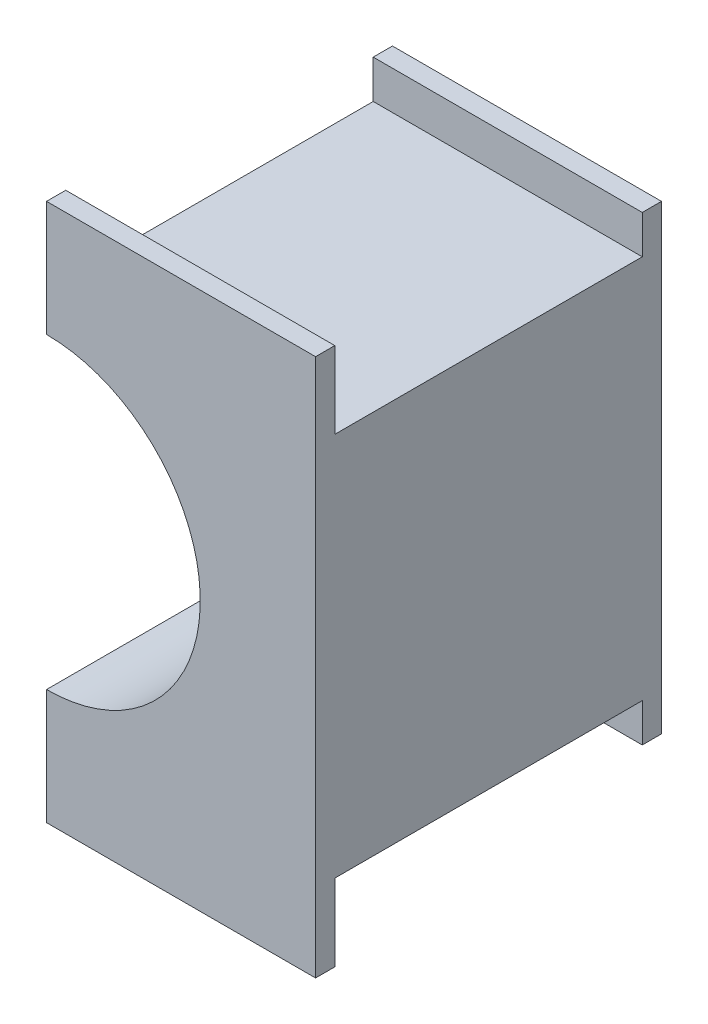
ISO-10303-21;
HEADER;
FILE_DESCRIPTION(('STEP AP214'),'2;1');
FILE_NAME('part.step','',(''),(''),'','','');
FILE_SCHEMA(('AUTOMOTIVE_DESIGN { 1 0 10303 214 1 1 1 1 }'));
ENDSEC;
DATA;
#1=APPLICATION_CONTEXT('core data for automotive mechanical design processes');
#2=APPLICATION_PROTOCOL_DEFINITION('international standard','automotive_design',2000,#1);
#3=PRODUCT_CONTEXT('',#1,'mechanical');
#4=PRODUCT('Part','Part','',(#3));
#5=PRODUCT_RELATED_PRODUCT_CATEGORY('part','',(#4));
#6=PRODUCT_DEFINITION_FORMATION('','',#4);
#7=PRODUCT_DEFINITION_CONTEXT('part definition',#1,'design');
#8=PRODUCT_DEFINITION('design','',#6,#7);
#9=PRODUCT_DEFINITION_SHAPE('','',#8);
#10=(LENGTH_UNIT() NAMED_UNIT(*) SI_UNIT(.MILLI.,.METRE.));
#11=(NAMED_UNIT(*) PLANE_ANGLE_UNIT() SI_UNIT($,.RADIAN.));
#12=(NAMED_UNIT(*) SI_UNIT($,.STERADIAN.) SOLID_ANGLE_UNIT());
#13=UNCERTAINTY_MEASURE_WITH_UNIT(LENGTH_MEASURE(1.E-05),#10,'distance_accuracy_value','');
#14=(GEOMETRIC_REPRESENTATION_CONTEXT(3) GLOBAL_UNCERTAINTY_ASSIGNED_CONTEXT((#13)) GLOBAL_UNIT_ASSIGNED_CONTEXT((#10,
#11,#12)) REPRESENTATION_CONTEXT('',''));
#15=CARTESIAN_POINT('',(0.,0.,0.));
#16=DIRECTION('',(0.,0.,1.));
#17=DIRECTION('',(1.,0.,0.));
#18=AXIS2_PLACEMENT_3D('',#15,#16,#17);
#19=CARTESIAN_POINT('',(1.,0.,4.5));
#20=DIRECTION('',(1.,0.,0.));
#21=DIRECTION('',(0.,1.,0.));
#22=AXIS2_PLACEMENT_3D('',#19,#20,#21);
#23=PLANE('',#22);
#24=DIRECTION('',(0.,0.,1.));
#25=VECTOR('',#24,1.);
#26=CARTESIAN_POINT('',(1.,2.5,0.));
#27=LINE('',#26,#25);
#28=CARTESIAN_POINT('',(1.,2.5,0.25));
#29=VERTEX_POINT('',#28);
#30=CARTESIAN_POINT('',(1.,2.5,4.25));
#31=VERTEX_POINT('',#30);
#32=EDGE_CURVE('E146',#29,#31,#27,.T.);
#33=ORIENTED_EDGE('',*,*,#32,.T.);
#34=DIRECTION('',(0.,-1.,0.));
#35=VECTOR('',#34,1.);
#36=CARTESIAN_POINT('',(1.,0.,4.25));
#37=LINE('',#36,#35);
#38=CARTESIAN_POINT('',(1.,3.5,4.25));
#39=VERTEX_POINT('',#38);
#40=EDGE_CURVE('E138',#39,#31,#37,.T.);
#41=ORIENTED_EDGE('',*,*,#40,.F.);
#42=DIRECTION('',(0.,0.,-1.));
#43=VECTOR('',#42,1.);
#44=CARTESIAN_POINT('',(1.,3.5,4.5));
#45=LINE('',#44,#43);
#46=CARTESIAN_POINT('',(1.,3.5,4.5));
#47=VERTEX_POINT('',#46);
#48=EDGE_CURVE('E151',#47,#39,#45,.T.);
#49=ORIENTED_EDGE('',*,*,#48,.F.);
#50=DIRECTION('',(0.,-1.,0.));
#51=VECTOR('',#50,1.);
#52=CARTESIAN_POINT('',(1.,0.,4.5));
#53=LINE('',#52,#51);
#54=CARTESIAN_POINT('',(1.,-3.5,4.5));
#55=VERTEX_POINT('',#54);
#56=EDGE_CURVE('E216',#47,#55,#53,.T.);
#57=ORIENTED_EDGE('',*,*,#56,.T.);
#58=DIRECTION('',(0.,0.,-1.));
#59=VECTOR('',#58,1.);
#60=CARTESIAN_POINT('',(1.,-3.5,4.5));
#61=LINE('',#60,#59);
#62=CARTESIAN_POINT('',(1.,-3.5,4.25));
#63=VERTEX_POINT('',#62);
#64=EDGE_CURVE('E161',#55,#63,#61,.T.);
#65=ORIENTED_EDGE('',*,*,#64,.T.);
#66=DIRECTION('',(0.,1.,0.));
#67=VECTOR('',#66,1.);
#68=CARTESIAN_POINT('',(1.,0.,4.25));
#69=LINE('',#68,#67);
#70=CARTESIAN_POINT('',(1.,-2.5,4.25));
#71=VERTEX_POINT('',#70);
#72=EDGE_CURVE('E249',#63,#71,#69,.T.);
#73=ORIENTED_EDGE('',*,*,#72,.T.);
#74=DIRECTION('',(0.,0.,1.));
#75=VECTOR('',#74,1.);
#76=CARTESIAN_POINT('',(1.,-2.5,0.));
#77=LINE('',#76,#75);
#78=CARTESIAN_POINT('',(1.,-2.5,0.25));
#79=VERTEX_POINT('',#78);
#80=EDGE_CURVE('E208',#79,#71,#77,.T.);
#81=ORIENTED_EDGE('',*,*,#80,.F.);
#82=DIRECTION('',(0.,1.,0.));
#83=VECTOR('',#82,1.);
#84=CARTESIAN_POINT('',(1.,0.,0.25));
#85=LINE('',#84,#83);
#86=CARTESIAN_POINT('',(1.,-3.,0.25));
#87=VERTEX_POINT('',#86);
#88=EDGE_CURVE('E192',#87,#79,#85,.T.);
#89=ORIENTED_EDGE('',*,*,#88,.F.);
#90=DIRECTION('',(0.,0.,1.));
#91=VECTOR('',#90,1.);
#92=CARTESIAN_POINT('',(1.,-3.,0.));
#93=LINE('',#92,#91);
#94=CARTESIAN_POINT('',(1.,-3.,0.));
#95=VERTEX_POINT('',#94);
#96=EDGE_CURVE('E245',#95,#87,#93,.T.);
#97=ORIENTED_EDGE('',*,*,#96,.F.);
#98=DIRECTION('',(0.,-1.,0.));
#99=VECTOR('',#98,1.);
#100=CARTESIAN_POINT('',(1.,0.,0.));
#101=LINE('',#100,#99);
#102=CARTESIAN_POINT('',(1.,3.,0.));
#103=VERTEX_POINT('',#102);
#104=EDGE_CURVE('E226',#103,#95,#101,.T.);
#105=ORIENTED_EDGE('',*,*,#104,.F.);
#106=DIRECTION('',(0.,0.,1.));
#107=VECTOR('',#106,1.);
#108=CARTESIAN_POINT('',(1.,3.,0.));
#109=LINE('',#108,#107);
#110=CARTESIAN_POINT('',(1.,3.,0.25));
#111=VERTEX_POINT('',#110);
#112=EDGE_CURVE('E59',#103,#111,#109,.T.);
#113=ORIENTED_EDGE('',*,*,#112,.T.);
#114=DIRECTION('',(0.,-1.,0.));
#115=VECTOR('',#114,1.);
#116=CARTESIAN_POINT('',(1.,0.,0.25));
#117=LINE('',#116,#115);
#118=EDGE_CURVE('E378',#111,#29,#117,.T.);
#119=ORIENTED_EDGE('',*,*,#118,.T.);
#120=EDGE_LOOP('',(#33,#41,#49,#57,#65,#73,#81,#89,#97,#105,#113,#119));
#121=FACE_BOUND('',#120,.T.);
#122=ADVANCED_FACE('F36',(#121),#23,.T.);
#123=CARTESIAN_POINT('',(0.,3.5,4.5));
#124=DIRECTION('',(0.,1.,0.));
#125=DIRECTION('',(-1.,0.,0.));
#126=AXIS2_PLACEMENT_3D('',#123,#124,#125);
#127=PLANE('',#126);
#128=ORIENTED_EDGE('',*,*,#48,.T.);
#129=DIRECTION('',(-1.,0.,0.));
#130=VECTOR('',#129,1.);
#131=CARTESIAN_POINT('',(1.,3.5,4.25));
#132=LINE('',#131,#130);
#133=CARTESIAN_POINT('',(-2.5,3.5,4.25));
#134=VERTEX_POINT('',#133);
#135=EDGE_CURVE('E135',#39,#134,#132,.T.);
#136=ORIENTED_EDGE('',*,*,#135,.T.);
#137=DIRECTION('',(0.,0.,-1.));
#138=VECTOR('',#137,1.);
#139=CARTESIAN_POINT('',(-2.5,3.5,4.5));
#140=LINE('',#139,#138);
#141=CARTESIAN_POINT('',(-2.5,3.5,4.5));
#142=VERTEX_POINT('',#141);
#143=EDGE_CURVE('E162',#142,#134,#140,.T.);
#144=ORIENTED_EDGE('',*,*,#143,.F.);
#145=DIRECTION('',(1.,0.,0.));
#146=VECTOR('',#145,1.);
#147=CARTESIAN_POINT('',(0.,3.5,4.5));
#148=LINE('',#147,#146);
#149=EDGE_CURVE('E160',#142,#47,#148,.T.);
#150=ORIENTED_EDGE('',*,*,#149,.T.);
#151=EDGE_LOOP('',(#128,#136,#144,#150));
#152=FACE_BOUND('',#151,.T.);
#153=ADVANCED_FACE('F158',(#152),#127,.T.);
#154=CARTESIAN_POINT('',(-2.5,0.,4.5));
#155=DIRECTION('',(1.,0.,0.));
#156=DIRECTION('',(0.,1.,0.));
#157=AXIS2_PLACEMENT_3D('',#154,#155,#156);
#158=PLANE('',#157);
#159=DIRECTION('',(0.,-1.,0.));
#160=VECTOR('',#159,1.);
#161=CARTESIAN_POINT('',(-2.5,0.,4.25));
#162=LINE('',#161,#160);
#163=CARTESIAN_POINT('',(-2.5,2.5,4.25));
#164=VERTEX_POINT('',#163);
#165=EDGE_CURVE('E141',#134,#164,#162,.T.);
#166=ORIENTED_EDGE('',*,*,#165,.T.);
#167=DIRECTION('',(0.,0.,1.));
#168=VECTOR('',#167,1.);
#169=CARTESIAN_POINT('',(-2.5,2.5,0.));
#170=LINE('',#169,#168);
#171=CARTESIAN_POINT('',(-2.5,2.5,0.25));
#172=VERTEX_POINT('',#171);
#173=EDGE_CURVE('E155',#172,#164,#170,.T.);
#174=ORIENTED_EDGE('',*,*,#173,.F.);
#175=DIRECTION('',(0.,-1.,0.));
#176=VECTOR('',#175,1.);
#177=CARTESIAN_POINT('',(-2.5,0.,0.25));
#178=LINE('',#177,#176);
#179=CARTESIAN_POINT('',(-2.5,3.,0.25));
#180=VERTEX_POINT('',#179);
#181=EDGE_CURVE('E365',#180,#172,#178,.T.);
#182=ORIENTED_EDGE('',*,*,#181,.F.);
#183=DIRECTION('',(0.,0.,1.));
#184=VECTOR('',#183,1.);
#185=CARTESIAN_POINT('',(-2.5,3.,0.));
#186=LINE('',#185,#184);
#187=CARTESIAN_POINT('',(-2.5,3.,0.));
#188=VERTEX_POINT('',#187);
#189=EDGE_CURVE('E361',#188,#180,#186,.T.);
#190=ORIENTED_EDGE('',*,*,#189,.F.);
#191=DIRECTION('',(0.,-1.,0.));
#192=VECTOR('',#191,1.);
#193=CARTESIAN_POINT('',(-2.5,0.,0.));
#194=LINE('',#193,#192);
#195=CARTESIAN_POINT('',(-2.5,2.,0.));
#196=VERTEX_POINT('',#195);
#197=EDGE_CURVE('E212',#188,#196,#194,.T.);
#198=ORIENTED_EDGE('',*,*,#197,.T.);
#199=DIRECTION('',(0.,0.,-1.));
#200=VECTOR('',#199,1.);
#201=CARTESIAN_POINT('',(-2.5,2.,4.5));
#202=LINE('',#201,#200);
#203=CARTESIAN_POINT('',(-2.5,2.,4.5));
#204=VERTEX_POINT('',#203);
#205=EDGE_CURVE('E166',#204,#196,#202,.T.);
#206=ORIENTED_EDGE('',*,*,#205,.F.);
#207=DIRECTION('',(0.,-1.,0.));
#208=VECTOR('',#207,1.);
#209=CARTESIAN_POINT('',(-2.5,0.,4.5));
#210=LINE('',#209,#208);
#211=EDGE_CURVE('E214',#142,#204,#210,.T.);
#212=ORIENTED_EDGE('',*,*,#211,.F.);
#213=ORIENTED_EDGE('',*,*,#143,.T.);
#214=EDGE_LOOP('',(#166,#174,#182,#190,#198,#206,#212,#213));
#215=FACE_BOUND('',#214,.T.);
#216=ADVANCED_FACE('F236',(#215),#158,.F.);
#217=CARTESIAN_POINT('',(0.,0.,0.));
#218=DIRECTION('',(0.,0.,1.));
#219=DIRECTION('',(1.,0.,0.));
#220=AXIS2_PLACEMENT_3D('',#217,#218,#219);
#221=PLANE('',#220);
#222=ORIENTED_EDGE('',*,*,#197,.F.);
#223=DIRECTION('',(-1.,0.,0.));
#224=VECTOR('',#223,1.);
#225=CARTESIAN_POINT('',(1.,3.,0.));
#226=LINE('',#225,#224);
#227=EDGE_CURVE('E145',#103,#188,#226,.T.);
#228=ORIENTED_EDGE('',*,*,#227,.F.);
#229=ORIENTED_EDGE('',*,*,#104,.T.);
#230=DIRECTION('',(-1.,0.,0.));
#231=VECTOR('',#230,1.);
#232=CARTESIAN_POINT('',(1.,-3.,0.));
#233=LINE('',#232,#231);
#234=CARTESIAN_POINT('',(-2.5,-3.,0.));
#235=VERTEX_POINT('',#234);
#236=EDGE_CURVE('E204',#95,#235,#233,.T.);
#237=ORIENTED_EDGE('',*,*,#236,.T.);
#238=CARTESIAN_POINT('',(-2.5,-2.,0.));
#239=VERTEX_POINT('',#238);
#240=EDGE_CURVE('E222',#239,#235,#194,.T.);
#241=ORIENTED_EDGE('',*,*,#240,.F.);
#242=CARTESIAN_POINT('',(-2.5,0.,0.));
#243=DIRECTION('',(0.,0.,1.));
#244=DIRECTION('',(1.,0.,0.));
#245=AXIS2_PLACEMENT_3D('',#242,#243,#244);
#246=CIRCLE('',#245,2.);
#247=EDGE_CURVE('E219',#239,#196,#246,.T.);
#248=ORIENTED_EDGE('',*,*,#247,.T.);
#249=EDGE_LOOP('',(#222,#228,#229,#237,#241,#248));
#250=FACE_BOUND('',#249,.T.);
#251=ADVANCED_FACE('F241',(#250),#221,.F.);
#252=CARTESIAN_POINT('',(-2.5,0.,4.5));
#253=DIRECTION('',(0.,0.,-1.));
#254=DIRECTION('',(-1.,0.,0.));
#255=AXIS2_PLACEMENT_3D('',#252,#253,#254);
#256=CYLINDRICAL_SURFACE('',#255,2.);
#257=ORIENTED_EDGE('',*,*,#247,.F.);
#258=DIRECTION('',(0.,0.,-1.));
#259=VECTOR('',#258,1.);
#260=CARTESIAN_POINT('',(-2.5,-2.,4.5));
#261=LINE('',#260,#259);
#262=CARTESIAN_POINT('',(-2.5,-2.,4.5));
#263=VERTEX_POINT('',#262);
#264=EDGE_CURVE('E11',#263,#239,#261,.T.);
#265=ORIENTED_EDGE('',*,*,#264,.F.);
#266=CARTESIAN_POINT('',(-2.5,0.,4.5));
#267=DIRECTION('',(0.,0.,1.));
#268=DIRECTION('',(1.,0.,0.));
#269=AXIS2_PLACEMENT_3D('',#266,#267,#268);
#270=CIRCLE('',#269,2.);
#271=EDGE_CURVE('E209',#263,#204,#270,.T.);
#272=ORIENTED_EDGE('',*,*,#271,.T.);
#273=ORIENTED_EDGE('',*,*,#205,.T.);
#274=EDGE_LOOP('',(#257,#265,#272,#273));
#275=FACE_BOUND('',#274,.T.);
#276=ADVANCED_FACE('F38',(#275),#256,.F.);
#277=DIRECTION('',(0.,0.,1.));
#278=VECTOR('',#277,1.);
#279=CARTESIAN_POINT('',(-2.5,-2.5,0.));
#280=LINE('',#279,#278);
#281=CARTESIAN_POINT('',(-2.5,-2.5,0.25));
#282=VERTEX_POINT('',#281);
#283=CARTESIAN_POINT('',(-2.5,-2.5,4.25));
#284=VERTEX_POINT('',#283);
#285=EDGE_CURVE('E188',#282,#284,#280,.T.);
#286=ORIENTED_EDGE('',*,*,#285,.T.);
#287=DIRECTION('',(0.,1.,0.));
#288=VECTOR('',#287,1.);
#289=CARTESIAN_POINT('',(-2.5,0.,4.25));
#290=LINE('',#289,#288);
#291=CARTESIAN_POINT('',(-2.5,-3.5,4.25));
#292=VERTEX_POINT('',#291);
#293=EDGE_CURVE('E186',#292,#284,#290,.T.);
#294=ORIENTED_EDGE('',*,*,#293,.F.);
#295=DIRECTION('',(0.,0.,-1.));
#296=VECTOR('',#295,1.);
#297=CARTESIAN_POINT('',(-2.5,-3.5,4.5));
#298=LINE('',#297,#296);
#299=CARTESIAN_POINT('',(-2.5,-3.5,4.5));
#300=VERTEX_POINT('',#299);
#301=EDGE_CURVE('E44',#300,#292,#298,.T.);
#302=ORIENTED_EDGE('',*,*,#301,.F.);
#303=EDGE_CURVE('E183',#263,#300,#210,.T.);
#304=ORIENTED_EDGE('',*,*,#303,.F.);
#305=ORIENTED_EDGE('',*,*,#264,.T.);
#306=ORIENTED_EDGE('',*,*,#240,.T.);
#307=DIRECTION('',(0.,0.,1.));
#308=VECTOR('',#307,1.);
#309=CARTESIAN_POINT('',(-2.5,-3.,0.));
#310=LINE('',#309,#308);
#311=CARTESIAN_POINT('',(-2.5,-3.,0.25));
#312=VERTEX_POINT('',#311);
#313=EDGE_CURVE('E51',#235,#312,#310,.T.);
#314=ORIENTED_EDGE('',*,*,#313,.T.);
#315=DIRECTION('',(0.,1.,0.));
#316=VECTOR('',#315,1.);
#317=CARTESIAN_POINT('',(-2.5,0.,0.25));
#318=LINE('',#317,#316);
#319=EDGE_CURVE('E194',#312,#282,#318,.T.);
#320=ORIENTED_EDGE('',*,*,#319,.T.);
#321=EDGE_LOOP('',(#286,#294,#302,#304,#305,#306,#314,#320));
#322=FACE_BOUND('',#321,.T.);
#323=ADVANCED_FACE('F182',(#322),#158,.F.);
#324=CARTESIAN_POINT('',(0.,-3.5,4.5));
#325=DIRECTION('',(0.,1.,0.));
#326=DIRECTION('',(0.,0.,1.));
#327=AXIS2_PLACEMENT_3D('',#324,#325,#326);
#328=PLANE('',#327);
#329=ORIENTED_EDGE('',*,*,#301,.T.);
#330=DIRECTION('',(-1.,0.,0.));
#331=VECTOR('',#330,1.);
#332=CARTESIAN_POINT('',(1.,-3.5,4.25));
#333=LINE('',#332,#331);
#334=EDGE_CURVE('E176',#63,#292,#333,.T.);
#335=ORIENTED_EDGE('',*,*,#334,.F.);
#336=ORIENTED_EDGE('',*,*,#64,.F.);
#337=DIRECTION('',(1.,0.,0.));
#338=VECTOR('',#337,1.);
#339=CARTESIAN_POINT('',(0.,-3.5,4.5));
#340=LINE('',#339,#338);
#341=EDGE_CURVE('E177',#300,#55,#340,.T.);
#342=ORIENTED_EDGE('',*,*,#341,.F.);
#343=EDGE_LOOP('',(#329,#335,#336,#342));
#344=FACE_BOUND('',#343,.T.);
#345=ADVANCED_FACE('F174',(#344),#328,.F.);
#346=CARTESIAN_POINT('',(0.,0.,4.5));
#347=DIRECTION('',(0.,0.,1.));
#348=DIRECTION('',(1.,0.,0.));
#349=AXIS2_PLACEMENT_3D('',#346,#347,#348);
#350=PLANE('',#349);
#351=ORIENTED_EDGE('',*,*,#271,.F.);
#352=ORIENTED_EDGE('',*,*,#303,.T.);
#353=ORIENTED_EDGE('',*,*,#341,.T.);
#354=ORIENTED_EDGE('',*,*,#56,.F.);
#355=ORIENTED_EDGE('',*,*,#149,.F.);
#356=ORIENTED_EDGE('',*,*,#211,.T.);
#357=EDGE_LOOP('',(#351,#352,#353,#354,#355,#356));
#358=FACE_BOUND('',#357,.T.);
#359=ADVANCED_FACE('F234',(#358),#350,.T.);
#360=CARTESIAN_POINT('',(1.,0.,0.25));
#361=DIRECTION('',(0.,0.,1.));
#362=DIRECTION('',(0.,-1.,0.));
#363=AXIS2_PLACEMENT_3D('',#360,#361,#362);
#364=PLANE('',#363);
#365=ORIENTED_EDGE('',*,*,#319,.F.);
#366=DIRECTION('',(-1.,0.,0.));
#367=VECTOR('',#366,1.);
#368=CARTESIAN_POINT('',(1.,-3.,0.25));
#369=LINE('',#368,#367);
#370=EDGE_CURVE('E206',#87,#312,#369,.T.);
#371=ORIENTED_EDGE('',*,*,#370,.F.);
#372=ORIENTED_EDGE('',*,*,#88,.T.);
#373=DIRECTION('',(-1.,0.,0.));
#374=VECTOR('',#373,1.);
#375=CARTESIAN_POINT('',(1.,-2.5,0.25));
#376=LINE('',#375,#374);
#377=EDGE_CURVE('E198',#79,#282,#376,.T.);
#378=ORIENTED_EDGE('',*,*,#377,.T.);
#379=EDGE_LOOP('',(#365,#371,#372,#378));
#380=FACE_BOUND('',#379,.T.);
#381=ADVANCED_FACE('F257',(#380),#364,.T.);
#382=CARTESIAN_POINT('',(1.,-2.5,0.));
#383=DIRECTION('',(0.,-1.,0.));
#384=DIRECTION('',(1.,0.,0.));
#385=AXIS2_PLACEMENT_3D('',#382,#383,#384);
#386=PLANE('',#385);
#387=ORIENTED_EDGE('',*,*,#285,.F.);
#388=ORIENTED_EDGE('',*,*,#377,.F.);
#389=ORIENTED_EDGE('',*,*,#80,.T.);
#390=DIRECTION('',(-1.,0.,0.));
#391=VECTOR('',#390,1.);
#392=CARTESIAN_POINT('',(1.,-2.5,4.25));
#393=LINE('',#392,#391);
#394=EDGE_CURVE('E201',#71,#284,#393,.T.);
#395=ORIENTED_EDGE('',*,*,#394,.T.);
#396=EDGE_LOOP('',(#387,#388,#389,#395));
#397=FACE_BOUND('',#396,.T.);
#398=ADVANCED_FACE('F260',(#397),#386,.T.);
#399=CARTESIAN_POINT('',(1.,0.,4.25));
#400=DIRECTION('',(0.,0.,1.));
#401=DIRECTION('',(1.,0.,0.));
#402=AXIS2_PLACEMENT_3D('',#399,#400,#401);
#403=PLANE('',#402);
#404=ORIENTED_EDGE('',*,*,#293,.T.);
#405=ORIENTED_EDGE('',*,*,#394,.F.);
#406=ORIENTED_EDGE('',*,*,#72,.F.);
#407=ORIENTED_EDGE('',*,*,#334,.T.);
#408=EDGE_LOOP('',(#404,#405,#406,#407));
#409=FACE_BOUND('',#408,.T.);
#410=ADVANCED_FACE('F261',(#409),#403,.F.);
#411=CARTESIAN_POINT('',(1.,-3.,0.));
#412=DIRECTION('',(0.,-1.,0.));
#413=DIRECTION('',(1.,0.,0.));
#414=AXIS2_PLACEMENT_3D('',#411,#412,#413);
#415=PLANE('',#414);
#416=ORIENTED_EDGE('',*,*,#313,.F.);
#417=ORIENTED_EDGE('',*,*,#236,.F.);
#418=ORIENTED_EDGE('',*,*,#96,.T.);
#419=ORIENTED_EDGE('',*,*,#370,.T.);
#420=EDGE_LOOP('',(#416,#417,#418,#419));
#421=FACE_BOUND('',#420,.T.);
#422=ADVANCED_FACE('F244',(#421),#415,.T.);
#423=CARTESIAN_POINT('',(1.,0.,4.25));
#424=DIRECTION('',(0.,0.,-1.));
#425=DIRECTION('',(-1.,0.,0.));
#426=AXIS2_PLACEMENT_3D('',#423,#424,#425);
#427=PLANE('',#426);
#428=ORIENTED_EDGE('',*,*,#165,.F.);
#429=ORIENTED_EDGE('',*,*,#135,.F.);
#430=ORIENTED_EDGE('',*,*,#40,.T.);
#431=DIRECTION('',(-1.,0.,0.));
#432=VECTOR('',#431,1.);
#433=CARTESIAN_POINT('',(1.,2.5,4.25));
#434=LINE('',#433,#432);
#435=EDGE_CURVE('E223',#31,#164,#434,.T.);
#436=ORIENTED_EDGE('',*,*,#435,.T.);
#437=EDGE_LOOP('',(#428,#429,#430,#436));
#438=FACE_BOUND('',#437,.T.);
#439=ADVANCED_FACE('F137',(#438),#427,.T.);
#440=CARTESIAN_POINT('',(1.,2.5,0.));
#441=DIRECTION('',(0.,-1.,0.));
#442=DIRECTION('',(1.,0.,0.));
#443=AXIS2_PLACEMENT_3D('',#440,#441,#442);
#444=PLANE('',#443);
#445=ORIENTED_EDGE('',*,*,#173,.T.);
#446=ORIENTED_EDGE('',*,*,#435,.F.);
#447=ORIENTED_EDGE('',*,*,#32,.F.);
#448=DIRECTION('',(-1.,0.,0.));
#449=VECTOR('',#448,1.);
#450=CARTESIAN_POINT('',(1.,2.5,0.25));
#451=LINE('',#450,#449);
#452=EDGE_CURVE('E375',#29,#172,#451,.T.);
#453=ORIENTED_EDGE('',*,*,#452,.T.);
#454=EDGE_LOOP('',(#445,#446,#447,#453));
#455=FACE_BOUND('',#454,.T.);
#456=ADVANCED_FACE('F325',(#455),#444,.F.);
#457=CARTESIAN_POINT('',(1.,0.,0.25));
#458=DIRECTION('',(0.,0.,-1.));
#459=DIRECTION('',(0.,1.,0.));
#460=AXIS2_PLACEMENT_3D('',#457,#458,#459);
#461=PLANE('',#460);
#462=ORIENTED_EDGE('',*,*,#181,.T.);
#463=ORIENTED_EDGE('',*,*,#452,.F.);
#464=ORIENTED_EDGE('',*,*,#118,.F.);
#465=DIRECTION('',(-1.,0.,0.));
#466=VECTOR('',#465,1.);
#467=CARTESIAN_POINT('',(1.,3.,0.25));
#468=LINE('',#467,#466);
#469=EDGE_CURVE('E363',#111,#180,#468,.T.);
#470=ORIENTED_EDGE('',*,*,#469,.T.);
#471=EDGE_LOOP('',(#462,#463,#464,#470));
#472=FACE_BOUND('',#471,.T.);
#473=ADVANCED_FACE('F334',(#472),#461,.F.);
#474=CARTESIAN_POINT('',(1.,3.,0.));
#475=DIRECTION('',(0.,-1.,0.));
#476=DIRECTION('',(1.,0.,0.));
#477=AXIS2_PLACEMENT_3D('',#474,#475,#476);
#478=PLANE('',#477);
#479=ORIENTED_EDGE('',*,*,#189,.T.);
#480=ORIENTED_EDGE('',*,*,#469,.F.);
#481=ORIENTED_EDGE('',*,*,#112,.F.);
#482=ORIENTED_EDGE('',*,*,#227,.T.);
#483=EDGE_LOOP('',(#479,#480,#481,#482));
#484=FACE_BOUND('',#483,.T.);
#485=ADVANCED_FACE('F344',(#484),#478,.F.);
#486=CLOSED_SHELL('',(#122,#153,#216,#251,#276,#323,#345,#359,#381,#398,#410,#422,#439,#456,
#473,#485));
#487=MANIFOLD_SOLID_BREP('B2',#486);
#488=ADVANCED_BREP_SHAPE_REPRESENTATION('',(#18,#487),#14);
#489=SHAPE_DEFINITION_REPRESENTATION(#9,#488);
ENDSEC;
END-ISO-10303-21;
